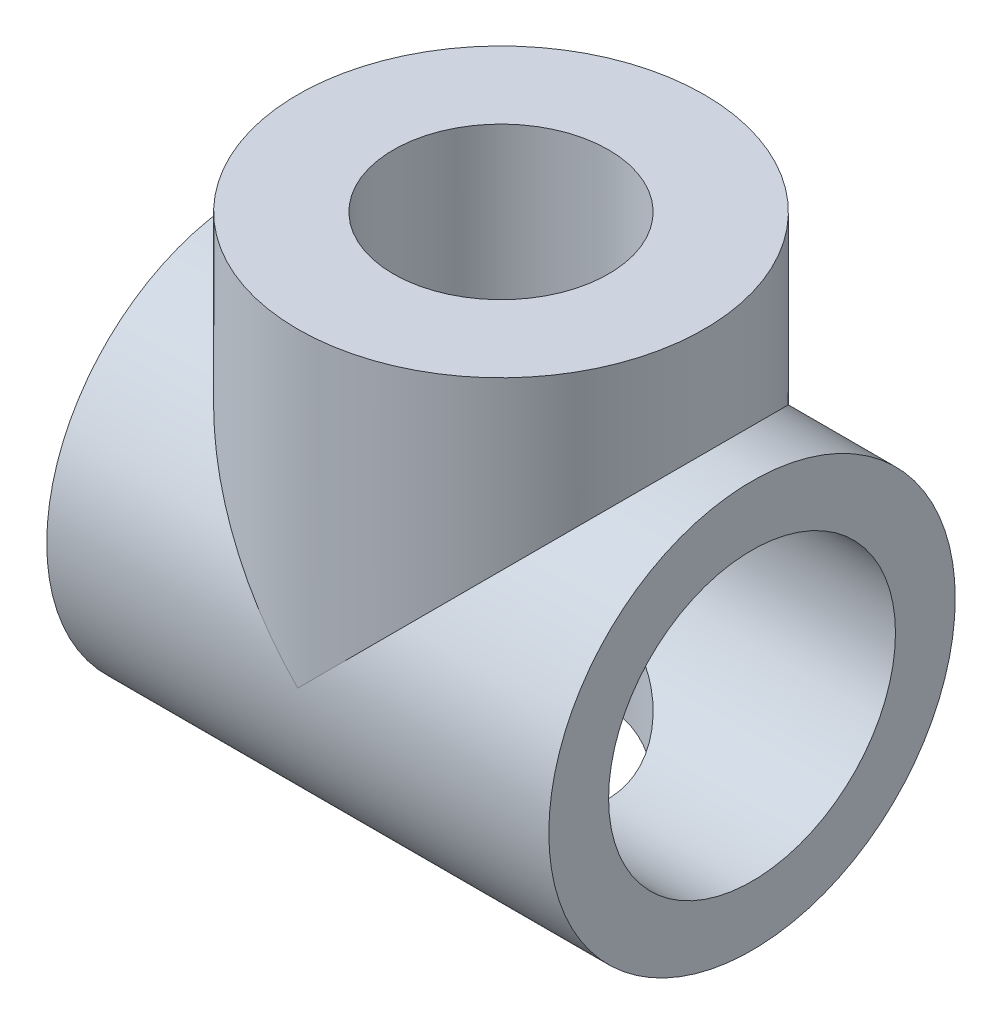
ISO-10303-21;
HEADER;
FILE_DESCRIPTION(('STEP AP214'),'2;1');
FILE_NAME('part.step','',(''),(''),'','','');
FILE_SCHEMA(('AUTOMOTIVE_DESIGN { 1 0 10303 214 1 1 1 1 }'));
ENDSEC;
DATA;
#1=APPLICATION_CONTEXT('core data for automotive mechanical design processes');
#2=APPLICATION_PROTOCOL_DEFINITION('international standard','automotive_design',2000,#1);
#3=PRODUCT_CONTEXT('',#1,'mechanical');
#4=PRODUCT('Part','Part','',(#3));
#5=PRODUCT_RELATED_PRODUCT_CATEGORY('part','',(#4));
#6=PRODUCT_DEFINITION_FORMATION('','',#4);
#7=PRODUCT_DEFINITION_CONTEXT('part definition',#1,'design');
#8=PRODUCT_DEFINITION('design','',#6,#7);
#9=PRODUCT_DEFINITION_SHAPE('','',#8);
#10=(LENGTH_UNIT() NAMED_UNIT(*) SI_UNIT(.MILLI.,.METRE.));
#11=(NAMED_UNIT(*) PLANE_ANGLE_UNIT() SI_UNIT($,.RADIAN.));
#12=(NAMED_UNIT(*) SI_UNIT($,.STERADIAN.) SOLID_ANGLE_UNIT());
#13=UNCERTAINTY_MEASURE_WITH_UNIT(LENGTH_MEASURE(1.E-05),#10,'distance_accuracy_value','');
#14=(GEOMETRIC_REPRESENTATION_CONTEXT(3) GLOBAL_UNCERTAINTY_ASSIGNED_CONTEXT((#13)) GLOBAL_UNIT_ASSIGNED_CONTEXT((#10,
#11,#12)) REPRESENTATION_CONTEXT('',''));
#15=CARTESIAN_POINT('',(0.,0.,0.));
#16=DIRECTION('',(0.,0.,1.));
#17=DIRECTION('',(1.,0.,0.));
#18=AXIS2_PLACEMENT_3D('',#15,#16,#17);
#19=CARTESIAN_POINT('',(-21.,0.,0.));
#20=DIRECTION('',(1.,0.,0.));
#21=DIRECTION('',(0.,0.,-1.));
#22=AXIS2_PLACEMENT_3D('',#19,#20,#21);
#23=CYLINDRICAL_SURFACE('',#22,17.);
#24=CARTESIAN_POINT('',(21.,0.,0.));
#25=DIRECTION('',(1.,0.,0.));
#26=DIRECTION('',(0.,0.,-1.));
#27=AXIS2_PLACEMENT_3D('',#24,#25,#26);
#28=CIRCLE('',#27,17.);
#29=CARTESIAN_POINT('',(21.,0.,-17.));
#30=VERTEX_POINT('',#29);
#31=EDGE_CURVE('E127',#30,#30,#28,.T.);
#32=ORIENTED_EDGE('',*,*,#31,.F.);
#33=EDGE_LOOP('',(#32));
#34=FACE_BOUND('',#33,.T.);
#35=CARTESIAN_POINT('',(-21.,0.,0.));
#36=DIRECTION('',(1.,0.,0.));
#37=DIRECTION('',(0.,0.,-1.));
#38=AXIS2_PLACEMENT_3D('',#35,#36,#37);
#39=CIRCLE('',#38,17.);
#40=CARTESIAN_POINT('',(-21.,0.,-17.));
#41=VERTEX_POINT('',#40);
#42=EDGE_CURVE('E66',#41,#41,#39,.T.);
#43=ORIENTED_EDGE('',*,*,#42,.T.);
#44=EDGE_LOOP('',(#43));
#45=FACE_BOUND('',#44,.T.);
#46=CARTESIAN_POINT('',(0.,0.,0.));
#47=DIRECTION('',(0.707106781186547,-0.707106781186547,0.));
#48=DIRECTION('',(-0.707106781186547,-0.707106781186547,0.));
#49=AXIS2_PLACEMENT_3D('',#46,#47,#48);
#50=ELLIPSE('',#49,24.0416305603426,17.);
#51=CARTESIAN_POINT('',(0.,0.,17.));
#52=VERTEX_POINT('',#51);
#53=CARTESIAN_POINT('',(0.,0.,-17.));
#54=VERTEX_POINT('',#53);
#55=EDGE_CURVE('E54',#52,#54,#50,.F.);
#56=ORIENTED_EDGE('',*,*,#55,.F.);
#57=CARTESIAN_POINT('',(0.,0.,0.));
#58=DIRECTION('',(-0.707106781186547,-0.707106781186547,0.));
#59=DIRECTION('',(0.707106781186547,-0.707106781186547,0.));
#60=AXIS2_PLACEMENT_3D('',#57,#58,#59);
#61=ELLIPSE('',#60,24.0416305603426,17.);
#62=EDGE_CURVE('E62',#54,#52,#61,.F.);
#63=ORIENTED_EDGE('',*,*,#62,.F.);
#64=EDGE_LOOP('',(#56,#63));
#65=FACE_BOUND('',#64,.T.);
#66=CARTESIAN_POINT('',(0.,-14.422205101856,-9.));
#67=CARTESIAN_POINT('',(-0.232373529451211,-14.4222043763024,-9.00000062576505));
#68=CARTESIAN_POINT('',(-0.464740452590223,-14.4278398144868,-8.99098923459077));
#69=CARTESIAN_POINT('',(-0.92763874877839,-14.4501573437859,-8.95507663420356));
#70=CARTESIAN_POINT('',(-1.15816937617861,-14.4668437117943,-8.9281684986357));
#71=CARTESIAN_POINT('',(-1.61579589330959,-14.5106455372305,-8.85680034590887));
#72=CARTESIAN_POINT('',(-1.84288674844299,-14.5377749860646,-8.81231677946018));
#73=CARTESIAN_POINT('',(-2.29180786581765,-14.6014717364069,-8.70636754509761));
#74=CARTESIAN_POINT('',(-2.51363575641698,-14.638043207756,-8.64489437328773));
#75=CARTESIAN_POINT('',(-2.94918399130645,-14.7191092082797,-8.50612898991123));
#76=CARTESIAN_POINT('',(-3.16294671898519,-14.7635521965977,-8.42893922268629));
#77=CARTESIAN_POINT('',(-3.58281344196142,-14.8591634139008,-8.25922184623658));
#78=CARTESIAN_POINT('',(-3.7889146028692,-14.9103341006475,-8.16668862850277));
#79=CARTESIAN_POINT('',(-4.19244887279489,-15.017949561011,-7.96705976018305));
#80=CARTESIAN_POINT('',(-4.38988328965565,-15.0743935348204,-7.85996631685035));
#81=CARTESIAN_POINT('',(-4.77536979352251,-15.1911291614756,-7.63190690499492));
#82=CARTESIAN_POINT('',(-4.96342156186845,-15.2514209448452,-7.51094046576726));
#83=CARTESIAN_POINT('',(-5.3465417828879,-15.3801817781599,-7.24389221821668));
#84=CARTESIAN_POINT('',(-5.5406319721487,-15.4488893762406,-7.0965205152372));
#85=CARTESIAN_POINT('',(-5.91600233276169,-15.5874517353745,-6.78676189218288));
#86=CARTESIAN_POINT('',(-6.09728183815375,-15.6573065558334,-6.6243741925168));
#87=CARTESIAN_POINT('',(-6.44629481328567,-15.7964899608243,-6.28526115469159));
#88=CARTESIAN_POINT('',(-6.61402204786294,-15.8658182899863,-6.10852929114645));
#89=CARTESIAN_POINT('',(-6.93500137489115,-16.0022854457377,-5.74153249314863));
#90=CARTESIAN_POINT('',(-7.08825114589662,-16.0694239200601,-5.55126539688179));
#91=CARTESIAN_POINT('',(-7.39072079290602,-16.2050322948974,-5.14264577769022));
#92=CARTESIAN_POINT('',(-7.53868759939727,-16.2731954920296,-4.92326054964398));
#93=CARTESIAN_POINT('',(-7.8153804025033,-16.403208903292,-4.47102472447402));
#94=CARTESIAN_POINT('',(-7.94411471833436,-16.4650618432972,-4.23818001019603));
#95=CARTESIAN_POINT('',(-8.1810886831158,-16.580697109142,-3.76043332600801));
#96=CARTESIAN_POINT('',(-8.28933431038829,-16.6344817882378,-3.51553489956948));
#97=CARTESIAN_POINT('',(-8.48407432295711,-16.7323765772602,-3.01537336993476));
#98=CARTESIAN_POINT('',(-8.57057135100269,-16.7764878625518,-2.76011153041601));
#99=CARTESIAN_POINT('',(-8.71476751089212,-16.8506278802714,-2.26159183704002));
#100=CARTESIAN_POINT('',(-8.77418919813568,-16.8814878867179,-2.01895536343818));
#101=CARTESIAN_POINT('',(-8.87277636517636,-16.9329379341249,-1.52852351721971));
#102=CARTESIAN_POINT('',(-8.91194281211255,-16.9535284654265,-1.28072839150413));
#103=CARTESIAN_POINT('',(-8.96945137777015,-16.9838293901003,-0.782216556126573));
#104=CARTESIAN_POINT('',(-8.9878055888794,-16.9935461013692,-0.531501628581769));
#105=CARTESIAN_POINT('',(-9.00345814156065,-17.0018296226732,-0.0292384034881089));
#106=CARTESIAN_POINT('',(-9.00075798410504,-17.0003972275317,0.2223098333759));
#107=CARTESIAN_POINT('',(-8.97563788206268,-16.9871123112241,0.699528550806311));
#108=CARTESIAN_POINT('',(-8.95516404622293,-16.9762881858903,0.92533339178118));
#109=CARTESIAN_POINT('',(-8.89734980776647,-16.9458616709079,1.3741772285691));
#110=CARTESIAN_POINT('',(-8.8600092712912,-16.9262592115921,1.59721620241707));
#111=CARTESIAN_POINT('',(-8.7688865329215,-16.8787399347702,2.03899511286714));
#112=CARTESIAN_POINT('',(-8.71510449295321,-16.8508231991484,2.25773509178582));
#113=CARTESIAN_POINT('',(-8.59166973477852,-16.7873163773799,2.68954353701739));
#114=CARTESIAN_POINT('',(-8.52201641754748,-16.7517260016121,2.90261178892497));
#115=CARTESIAN_POINT('',(-8.36657855228801,-16.6731844590158,3.32437519757208));
#116=CARTESIAN_POINT('',(-8.28061048068221,-16.63015009721,3.53298720919376));
#117=CARTESIAN_POINT('',(-8.0938560894615,-16.5379543929982,3.94209436713934));
#118=CARTESIAN_POINT('',(-7.99306487662943,-16.4887910281872,4.14258680515773));
#119=CARTESIAN_POINT('',(-7.66964763036743,-16.3336317187681,4.73036313157018));
#120=CARTESIAN_POINT('',(-7.42588359718037,-16.2199174406707,5.10419965765736));
#121=CARTESIAN_POINT('',(-6.86049219183615,-15.9685886380079,5.8457572658455));
#122=CARTESIAN_POINT('',(-6.53344396069786,-15.8297190296641,6.20892118613643));
#123=CARTESIAN_POINT('',(-6.00260510055091,-15.6206546008118,6.71030256073168));
#124=CARTESIAN_POINT('',(-5.81878357236495,-15.5507832627235,6.87031351189004));
#125=CARTESIAN_POINT('',(-5.43836013979317,-15.4124737454541,7.17520945568927));
#126=CARTESIAN_POINT('',(-5.24175615628497,-15.3440358018266,7.32009197758702));
#127=CARTESIAN_POINT('',(-4.8209075098852,-15.2052191906499,7.60449051092364));
#128=CARTESIAN_POINT('',(-4.59570208594305,-15.1351028023996,7.74271518715582));
#129=CARTESIAN_POINT('',(-4.13268897597319,-15.0010019642641,7.99943172794706));
#130=CARTESIAN_POINT('',(-3.89488702717496,-14.9370147594388,8.11793247583611));
#131=CARTESIAN_POINT('',(-3.40807604935347,-14.8175356444393,8.33401969853009));
#132=CARTESIAN_POINT('',(-3.15907435897716,-14.7620382732747,8.43161963384427));
#133=CARTESIAN_POINT('',(-2.65141648424013,-14.6617922698603,8.60475897696281));
#134=CARTESIAN_POINT('',(-2.39276177564518,-14.6170420022942,8.68030174144018));
#135=CARTESIAN_POINT('',(-1.88917564194414,-14.5434543284165,8.80298999001995));
#136=CARTESIAN_POINT('',(-1.64482953912013,-14.5136216253731,8.85193994589715));
#137=CARTESIAN_POINT('',(-1.15175601241672,-14.466041774245,8.92948601647755));
#138=CARTESIAN_POINT('',(-0.903028856283356,-14.4482938902131,8.95808337062815));
#139=CARTESIAN_POINT('',(-0.403667423641377,-14.4256988216494,8.994424667776));
#140=CARTESIAN_POINT('',(-0.153034827599674,-14.4208413525752,9.00218523534004));
#141=CARTESIAN_POINT('',(0.347902273022042,-14.4242270885605,8.99675991934115));
#142=CARTESIAN_POINT('',(0.598206804927149,-14.4324691226036,8.98357590809702));
#143=CARTESIAN_POINT('',(1.06366399324733,-14.4597579564631,8.93957215018169));
#144=CARTESIAN_POINT('',(1.27915222720319,-14.4772591090859,8.91127068512541));
#145=CARTESIAN_POINT('',(1.70669034014811,-14.5212797481174,8.83935590008577));
#146=CARTESIAN_POINT('',(1.91873907769009,-14.5478021667086,8.79573760152178));
#147=CARTESIAN_POINT('',(2.33801237179456,-14.6090140692136,8.6936896932991));
#148=CARTESIAN_POINT('',(2.54523732639165,-14.6437028766337,8.63526131045897));
#149=CARTESIAN_POINT('',(2.95382133152171,-14.7202145404589,8.50417724270343));
#150=CARTESIAN_POINT('',(3.15517800319165,-14.7620402441622,8.43151587775468));
#151=CARTESIAN_POINT('',(3.76647482436573,-14.9004878042736,8.18607612769588));
#152=CARTESIAN_POINT('',(4.16515042576479,-15.0072408262313,7.99034464700556));
#153=CARTESIAN_POINT('',(4.92629975561252,-15.2360140563594,7.54495496074514));
#154=CARTESIAN_POINT('',(5.28875485143937,-15.3580420503437,7.29526920663774));
#155=CARTESIAN_POINT('',(5.82625691230495,-15.553523453554,6.86423359080789));
#156=CARTESIAN_POINT('',(6.01522159630074,-15.6254600961081,6.69925236107796));
#157=CARTESIAN_POINT('',(6.37878064710984,-15.7689867315602,6.35405022511538));
#158=CARTESIAN_POINT('',(6.5533789779591,-15.8405768149165,6.17383355073655));
#159=CARTESIAN_POINT('',(6.88743765604704,-15.9816725048945,5.79882063574023));
#160=CARTESIAN_POINT('',(7.04688473675299,-16.0511762489369,5.60401188025866));
#161=CARTESIAN_POINT('',(7.34941178301582,-16.1862764029393,5.20092433110434));
#162=CARTESIAN_POINT('',(7.49249856426548,-16.2518744345183,4.99265120370711));
#163=CARTESIAN_POINT('',(7.7666794846933,-16.3800499925179,4.55499703766289));
#164=CARTESIAN_POINT('',(7.89706578251143,-16.4424020251843,4.32510507219349));
#165=CARTESIAN_POINT('',(8.13778440961506,-16.5593618774268,3.85313308253476));
#166=CARTESIAN_POINT('',(8.24811583898236,-16.6139693494586,3.61105251203066));
#167=CARTESIAN_POINT('',(8.44736382866169,-16.7137824698965,3.11657401761835));
#168=CARTESIAN_POINT('',(8.5362973178793,-16.7589955467559,2.86418443581422));
#169=CARTESIAN_POINT('',(8.69166326636912,-16.8386624950657,2.3509257370342));
#170=CARTESIAN_POINT('',(8.75809878749058,-16.8731178305354,2.0900577792189));
#171=CARTESIAN_POINT('',(8.86211408543353,-16.9273537419758,1.58809323595221));
#172=CARTESIAN_POINT('',(8.90188584843924,-16.9482426208988,1.34756873674454));
#173=CARTESIAN_POINT('',(8.96180668371501,-16.9797916705842,0.863424053523259));
#174=CARTESIAN_POINT('',(8.98195707085504,-16.9904525267472,0.619804078052585));
#175=CARTESIAN_POINT('',(9.00235286320157,-17.001243574032,0.131592090635574));
#176=CARTESIAN_POINT('',(9.00260572696796,-17.0013777110803,-0.112999522710721));
#177=CARTESIAN_POINT('',(8.98322114056142,-16.991120992441,-0.601165648538066));
#178=CARTESIAN_POINT('',(8.96358447846036,-16.980730553763,-0.844740200933611));
#179=CARTESIAN_POINT('',(8.90704436985784,-16.9509562574503,-1.3095574412149));
#180=CARTESIAN_POINT('',(8.87163923401459,-16.9323538261532,-1.53103485865268));
#181=CARTESIAN_POINT('',(8.78460053621235,-16.8869129137305,-1.9699931590121));
#182=CARTESIAN_POINT('',(8.73296149337009,-16.8600716510873,-2.18747266587423));
#183=CARTESIAN_POINT('',(8.61402084308521,-16.7987725979753,-2.61692155464159));
#184=CARTESIAN_POINT('',(8.54672403058221,-16.764317139393,-2.8288926013765));
#185=CARTESIAN_POINT('',(8.39707858895186,-16.6885220108339,-3.24626606332047));
#186=CARTESIAN_POINT('',(8.31472418885774,-16.6471797019468,-3.45166592447323));
#187=CARTESIAN_POINT('',(8.13228147506046,-16.5567957606468,-3.86243518950489));
#188=CARTESIAN_POINT('',(8.03163792753637,-16.5075211470498,-4.06750647742742));
#189=CARTESIAN_POINT('',(7.81569204214586,-16.4035388050147,-4.46842538990806));
#190=CARTESIAN_POINT('',(7.70038434850761,-16.3488290931265,-4.66426960847641));
#191=CARTESIAN_POINT('',(7.45592784270197,-16.2351209327442,-5.04583856621044));
#192=CARTESIAN_POINT('',(7.32677720648336,-16.1761219193895,-5.23156196690485));
#193=CARTESIAN_POINT('',(7.05540905876764,-16.0550319812806,-5.59214896019523));
#194=CARTESIAN_POINT('',(6.91319023666751,-15.9929407466954,-5.76701146060219));
#195=CARTESIAN_POINT('',(6.60020181561065,-15.8600269131364,-6.12369239499591));
#196=CARTESIAN_POINT('',(6.42801033123554,-15.7889911707323,-6.30418585297529));
#197=CARTESIAN_POINT('',(6.06935607219238,-15.6464055505263,-6.65018919872483));
#198=CARTESIAN_POINT('',(5.88289202176917,-15.5748556272833,-6.81569774417365));
#199=CARTESIAN_POINT('',(5.49635981371422,-15.4330042199717,-7.13108065553284));
#200=CARTESIAN_POINT('',(5.29627706728585,-15.3627041797798,-7.28093780553379));
#201=CARTESIAN_POINT('',(4.88358019679142,-15.2253571173574,-7.56394367203928));
#202=CARTESIAN_POINT('',(4.67096682373273,-15.1583099006111,-7.69709338838924));
#203=CARTESIAN_POINT('',(4.22292235105009,-15.0261422509569,-7.95215261769948));
#204=CARTESIAN_POINT('',(3.98688024174743,-14.9612970464184,-8.07313527797574));
#205=CARTESIAN_POINT('',(3.5032223294721,-14.8397371057199,-8.29446575182941));
#206=CARTESIAN_POINT('',(3.25560457390522,-14.7830237478595,-8.39481006857936));
#207=CARTESIAN_POINT('',(2.7511759218555,-14.6801975843741,-8.57335390762207));
#208=CARTESIAN_POINT('',(2.4943934085963,-14.6340548617029,-8.65161607624996));
#209=CARTESIAN_POINT('',(1.97315998475943,-14.5542824201999,-8.78515446055727));
#210=CARTESIAN_POINT('',(1.70871431287091,-14.5206443607581,-8.84044600054968));
#211=CARTESIAN_POINT('',(1.20419256849498,-14.4704605563623,-8.92232041079801));
#212=CARTESIAN_POINT('',(0.964668329748119,-14.4524324048506,-8.95140803755293));
#213=CARTESIAN_POINT('',(0.48342707854218,-14.4283047795495,-8.99024795310022));
#214=CARTESIAN_POINT('',(0.241709965350477,-14.4222058565612,-8.99999934909261));
#215=CARTESIAN_POINT('',(0.,-14.422205101856,-9.));
#216=B_SPLINE_CURVE_WITH_KNOTS('',3,(#66,#67,#68,#69,#70,#71,#72,#73,#74,#75,#76,#77,#78,#79,
#80,#81,#82,#83,#84,#85,#86,#87,#88,#89,#90,#91,#92,#93,#94,#95,#96,#97,#98,#99,#100,#101,#102,
#103,#104,#105,#106,#107,#108,#109,#110,#111,#112,#113,#114,#115,#116,#117,#118,#119,#120,#121,
#122,#123,#124,#125,#126,#127,#128,#129,#130,#131,#132,#133,#134,#135,#136,#137,#138,#139,#140,
#141,#142,#143,#144,#145,#146,#147,#148,#149,#150,#151,#152,#153,#154,#155,#156,#157,#158,#159,
#160,#161,#162,#163,#164,#165,#166,#167,#168,#169,#170,#171,#172,#173,#174,#175,#176,#177,#178,
#179,#180,#181,#182,#183,#184,#185,#186,#187,#188,#189,#190,#191,#192,#193,#194,#195,#196,#197,
#198,#199,#200,#201,#202,#203,#204,#205,#206,#207,#208,#209,#210,#211,#212,#213,#214,#215),
.UNSPECIFIED.,.T.,.F.,(4,2,2,2,2,2,2,2,2,2,2,2,2,2,2,2,2,2,2,2,2,2,2,2,2,2,2,2,2,2,2,2,2,2,2,2,
2,2,2,2,2,2,2,2,2,2,2,2,2,2,2,2,2,2,2,2,2,2,2,2,2,2,2,2,2,2,2,2,2,2,2,2,2,2,4),(0.,
0.696869112714834,1.39400808309362,2.09208433393308,2.79046940219053,3.4844401455653,
4.17866511832918,4.87278496735879,5.56692837455497,6.32573512819672,7.08458129924062,
7.84377463733496,8.60308950535355,9.42180374576619,10.2401628109038,11.0582827205867,
11.8763031695285,12.6303806643799,13.3844221505178,14.1380252963519,14.8915747180783,
15.5717364011117,16.2519034821812,16.9320638647584,17.6122499226692,18.3005972200418,
18.9891722575848,20.3655060888116,21.8829591839488,22.6429096431477,23.4029840223642,
24.2221068990266,25.0408598521895,25.8590839169306,26.6771833988846,27.4290204606706,
28.1808117326233,28.9320030117109,29.6831271426157,30.336504362395,30.99009415266,
31.6436298193849,32.2974268294518,33.6621236162513,35.0275188576417,35.8096726732542,
36.591609944264,37.3742256945812,38.156514210378,38.9700674555651,39.7836571981607,
40.596601139864,41.4094343998802,42.1424985433663,42.8755135592893,43.608253804209,
44.3409650172962,45.0153720507556,45.6900070221417,46.3644356687288,47.0391233405409,
47.7394647191358,48.4400626212934,49.1407529533038,49.8415136341183,50.6187837295646,
51.3961233827141,52.1743092675258,52.9524485600795,53.7705008193654,54.5886915701616,
55.404537250543,56.2198377813218,56.9446726312256,57.6695409477069),.UNSPECIFIED.);
#217=CARTESIAN_POINT('',(0.,-14.422205101856,-9.));
#218=VERTEX_POINT('',#217);
#219=EDGE_CURVE('E90',#218,#218,#216,.T.);
#220=ORIENTED_EDGE('',*,*,#219,.T.);
#221=EDGE_LOOP('',(#220));
#222=FACE_BOUND('',#221,.T.);
#223=ADVANCED_FACE('F39',(#34,#45,#65,#222),#23,.T.);
#224=CARTESIAN_POINT('',(21.,0.,0.));
#225=DIRECTION('',(-1.,0.,0.));
#226=DIRECTION('',(0.,0.,1.));
#227=AXIS2_PLACEMENT_3D('',#224,#225,#226);
#228=CYLINDRICAL_SURFACE('',#227,12.);
#229=CARTESIAN_POINT('',(0.,-7.93725393319378,-9.));
#230=CARTESIAN_POINT('',(0.210047945354589,-7.93726008769209,-8.99999700492846));
#231=CARTESIAN_POINT('',(0.420142077343502,-7.94564059997079,-8.99262506088692));
#232=CARTESIAN_POINT('',(0.838045929195139,-7.97865018535012,-8.96334784421954));
#233=CARTESIAN_POINT('',(1.04585486336312,-8.0032846796036,-8.94143772269537));
#234=CARTESIAN_POINT('',(1.45762679674959,-8.06741599335539,-8.88361711104554));
#235=CARTESIAN_POINT('',(1.66158026311608,-8.10694559516818,-8.84767573350096));
#236=CARTESIAN_POINT('',(2.0638352347195,-8.19884235317378,-8.76258489524339));
#237=CARTESIAN_POINT('',(2.26213324916174,-8.25121725447619,-8.71342746414681));
#238=CARTESIAN_POINT('',(2.64925874237046,-8.3656947597056,-8.60356525931345));
#239=CARTESIAN_POINT('',(2.83818139531385,-8.42764667039382,-8.54303667662039));
#240=CARTESIAN_POINT('',(3.20903155435823,-8.55966578516624,-8.41075981679049));
#241=CARTESIAN_POINT('',(3.39095984006061,-8.62973208129692,-8.33901279461918));
#242=CARTESIAN_POINT('',(3.92593048375625,-8.84911786971174,-8.1078967220267));
#243=CARTESIAN_POINT('',(4.26845266022529,-9.00771710513604,-7.93256747620498));
#244=CARTESIAN_POINT('',(4.79449298111879,-9.27134774561229,-7.62010706297185));
#245=CARTESIAN_POINT('',(4.98738379901041,-9.37279820688496,-7.49523611495529));
#246=CARTESIAN_POINT('',(5.36246284391734,-9.57764573331366,-7.23163301821777));
#247=CARTESIAN_POINT('',(5.54465018857393,-9.68104295802921,-7.09289972927053));
#248=CARTESIAN_POINT('',(5.89824125314021,-9.88780382820126,-6.80171201703297));
#249=CARTESIAN_POINT('',(6.06962902217547,-9.99116720958863,-6.64923807036801));
#250=CARTESIAN_POINT('',(6.40090135117742,-10.1958119550385,-6.3309727217583));
#251=CARTESIAN_POINT('',(6.56078586718667,-10.2970933111438,-6.16518126892845));
#252=CARTESIAN_POINT('',(6.89990963061083,-10.5161174259194,-5.78521241974898));
#253=CARTESIAN_POINT('',(7.0764168556198,-10.6329889481264,-5.56807508037328));
#254=CARTESIAN_POINT('',(7.41033819872256,-10.8580806393513,-5.11527308350169));
#255=CARTESIAN_POINT('',(7.56774802310256,-10.9662988609696,-4.87960427909001));
#256=CARTESIAN_POINT('',(7.86123731171005,-11.1708551657334,-4.39112448711177));
#257=CARTESIAN_POINT('',(7.99735693973472,-11.2672155435241,-4.13834709829603));
#258=CARTESIAN_POINT('',(8.24636374948501,-11.4453021908216,-3.61675046873795));
#259=CARTESIAN_POINT('',(8.35926322117876,-11.5270361987841,-3.34793981178401));
#260=CARTESIAN_POINT('',(8.52931240454799,-11.6510470866384,-2.87972534634464));
#261=CARTESIAN_POINT('',(8.59300514968108,-11.6977883308111,-2.68385116124619));
#262=CARTESIAN_POINT('',(8.70719953010689,-11.7819280636668,-2.28635185786148));
#263=CARTESIAN_POINT('',(8.75770432369216,-11.8193287891532,-2.08472812934717));
#264=CARTESIAN_POINT('',(8.84482565226319,-11.8840267025366,-1.67704518510364));
#265=CARTESIAN_POINT('',(8.88145145128226,-11.9113306296095,-1.47098902538559));
#266=CARTESIAN_POINT('',(8.940329620786,-11.9552962912754,-1.05569247788542));
#267=CARTESIAN_POINT('',(8.9625814760385,-11.9719576443866,-0.846451976236114));
#268=CARTESIAN_POINT('',(8.99240142040101,-11.9942980249635,-0.425786006339292));
#269=CARTESIAN_POINT('',(8.99993087863759,-11.9999481593843,-0.214356249299964));
#270=CARTESIAN_POINT('',(9.00006817197728,-12.0000511285769,0.208510065394761));
#271=CARTESIAN_POINT('',(8.99267606612721,-11.9945040076578,0.419946623019937));
#272=CARTESIAN_POINT('',(8.96308696595144,-11.9723361276214,0.841232961940921));
#273=CARTESIAN_POINT('',(8.94088704507851,-11.9557131795301,1.05108242127718));
#274=CARTESIAN_POINT('',(8.88202666528978,-11.91175952135,1.46759716786933));
#275=CARTESIAN_POINT('',(8.84536630234775,-11.884428882328,1.67426247624893));
#276=CARTESIAN_POINT('',(8.75963576561918,-11.8207624618912,2.07593135593429));
#277=CARTESIAN_POINT('',(8.71103834107328,-11.7847705995305,2.27109110323147));
#278=CARTESIAN_POINT('',(8.601463443314,-11.7040079560834,2.65610708366029));
#279=CARTESIAN_POINT('',(8.54048165956892,-11.6592341185062,2.84596144393919));
#280=CARTESIAN_POINT('',(8.40685252358632,-11.5617076348438,3.21933855599491));
#281=CARTESIAN_POINT('',(8.33420811635907,-11.5089570032293,3.40286289203465));
#282=CARTESIAN_POINT('',(8.17793557020214,-11.3963019808328,3.76296650073168));
#283=CARTESIAN_POINT('',(8.09430344250448,-11.3363949928669,3.93954322086584));
#284=CARTESIAN_POINT('',(7.90719531405391,-11.2035232641165,4.30378588140324));
#285=CARTESIAN_POINT('',(7.80255192082885,-11.129847059551,4.49059379921736));
#286=CARTESIAN_POINT('',(7.58156081652009,-10.9760554268286,4.85440889308923));
#287=CARTESIAN_POINT('',(7.4652081856563,-10.8959372948829,5.03141190065809));
#288=CARTESIAN_POINT('',(7.09969060456716,-10.6476940478331,5.54724944127269));
#289=CARTESIAN_POINT('',(6.83406064784081,-10.4716762362332,5.87092272315764));
#290=CARTESIAN_POINT('',(6.37896317466503,-10.1820425358953,6.3537910740115));
#291=CARTESIAN_POINT('',(6.20170533555787,-10.0717287555428,6.52686902280105));
#292=CARTESIAN_POINT('',(5.8339973996875,-9.84956990495244,6.85751963167764));
#293=CARTESIAN_POINT('',(5.64354476338401,-9.73772454328052,7.0150892927528));
#294=CARTESIAN_POINT('',(5.24987544653014,-9.51497926304422,7.31436974021301));
#295=CARTESIAN_POINT('',(5.04665206901147,-9.40407987575603,7.45607209560136));
#296=CARTESIAN_POINT('',(4.62776966050861,-9.18609053264199,7.7230439593456));
#297=CARTESIAN_POINT('',(4.41211342315151,-9.07899972971516,7.84831713873149));
#298=CARTESIAN_POINT('',(4.0122075628318,-8.89230175064854,8.05870205966756));
#299=CARTESIAN_POINT('',(3.83014541952843,-8.81143781001446,8.14686298749761));
#300=CARTESIAN_POINT('',(3.45813249384851,-8.6562178697362,8.31160003485239));
#301=CARTESIAN_POINT('',(3.26818180096174,-8.58186179629478,8.38817628575099));
#302=CARTESIAN_POINT('',(2.88096864122825,-8.44200530333541,8.52891415509824));
#303=CARTESIAN_POINT('',(2.68371988758802,-8.37648925269761,8.59309777546026));
#304=CARTESIAN_POINT('',(2.28214704026724,-8.25660529743018,8.70835203906579));
#305=CARTESIAN_POINT('',(2.0778257709943,-8.20223300123507,8.75942784988444));
#306=CARTESIAN_POINT('',(1.70412217059056,-8.11651502889636,8.83882850828779));
#307=CARTESIAN_POINT('',(1.53582721559991,-8.08274185436784,8.86965539928518));
#308=CARTESIAN_POINT('',(1.19616276404445,-8.02513724983308,8.92180971113034));
#309=CARTESIAN_POINT('',(1.02479506136833,-8.00130020427445,8.94314249817614));
#310=CARTESIAN_POINT('',(0.680097364480576,-7.96449630407447,8.97593509653417));
#311=CARTESIAN_POINT('',(0.506769204364536,-7.9515200238538,8.98740346897668));
#312=CARTESIAN_POINT('',(0.159253094620623,-7.93695333664642,9.00027048562989));
#313=CARTESIAN_POINT('',(-0.0149348638307105,-7.93536304674963,9.00166902628564));
#314=CARTESIAN_POINT('',(-0.362879350212139,-7.94364018314973,8.99436543755864));
#315=CARTESIAN_POINT('',(-0.536635717274004,-7.95351138074574,8.98565998354792));
#316=CARTESIAN_POINT('',(-0.882365217034983,-7.98429159422233,8.95832052102714));
#317=CARTESIAN_POINT('',(-1.05433834769069,-8.00520062274973,8.93968650114121));
#318=CARTESIAN_POINT('',(-1.39560544217011,-8.05724702704553,8.89280562651887));
#319=CARTESIAN_POINT('',(-1.56489581361444,-8.08839707277409,8.86454686269582));
#320=CARTESIAN_POINT('',(-1.89980564235921,-8.15980763291469,8.7988572216387));
#321=CARTESIAN_POINT('',(-2.0654228945175,-8.20007346563849,8.7614209890459));
#322=CARTESIAN_POINT('',(-2.45349284207391,-8.30499042232178,8.66222331604646));
#323=CARTESIAN_POINT('',(-2.67402231393399,-8.37312824030809,8.5966014364667));
#324=CARTESIAN_POINT('',(-3.10590246543935,-8.52088047447664,8.4501715586241));
#325=CARTESIAN_POINT('',(-3.31725302418304,-8.60049504176718,8.36936336040677));
#326=CARTESIAN_POINT('',(-3.73077231591406,-8.76828905787122,8.19340630318842));
#327=CARTESIAN_POINT('',(-3.93292593098628,-8.85648191049531,8.0982348689868));
#328=CARTESIAN_POINT('',(-4.32753870623069,-9.03863686622729,7.89441106526341));
#329=CARTESIAN_POINT('',(-4.51999873980326,-9.13259844786869,7.78575991334227));
#330=CARTESIAN_POINT('',(-4.90180991263666,-9.32737029179403,7.551436118696));
#331=CARTESIAN_POINT('',(-5.09081116972656,-9.42830523194776,7.42529782974467));
#332=CARTESIAN_POINT('',(-5.45829490188362,-9.6316957889483,7.15950114372978));
#333=CARTESIAN_POINT('',(-5.63677373945681,-9.73415191650946,7.01983811487991));
#334=CARTESIAN_POINT('',(-5.98292305403432,-9.93860471734104,6.72725781221161));
#335=CARTESIAN_POINT('',(-6.15059004760186,-10.0406012327828,6.57433630351993));
#336=CARTESIAN_POINT('',(-6.47458853361291,-10.2422766253488,6.25550647779105));
#337=CARTESIAN_POINT('',(-6.63091988453178,-10.3419554735266,6.08959799866627));
#338=CARTESIAN_POINT('',(-6.96449579754631,-10.558635371644,5.70731553420715));
#339=CARTESIAN_POINT('',(-7.1388422830702,-10.6746602145857,5.48783754128755));
#340=CARTESIAN_POINT('',(-7.46821642957763,-10.8976869976134,5.03042447106934));
#341=CARTESIAN_POINT('',(-7.62323970527303,-11.0046868877648,4.79248522390458));
#342=CARTESIAN_POINT('',(-7.91171968233961,-11.2064581328722,4.29954629195373));
#343=CARTESIAN_POINT('',(-8.04521278850655,-11.3012500740479,4.04457645864977));
#344=CARTESIAN_POINT('',(-8.28865751370086,-11.4758287345712,3.51880116378812));
#345=CARTESIAN_POINT('',(-8.39862183796373,-11.5556235493259,3.24800434968827));
#346=CARTESIAN_POINT('',(-8.56313619757074,-11.6758381634808,2.77750418580964));
#347=CARTESIAN_POINT('',(-8.62436198654747,-11.7208474819153,2.58127726584339));
#348=CARTESIAN_POINT('',(-8.73359723263136,-11.801455727109,2.18330579663549));
#349=CARTESIAN_POINT('',(-8.78160984600538,-11.8370569011359,1.98156257776733));
#350=CARTESIAN_POINT('',(-8.86374851280414,-11.8981210340985,1.57390200697549));
#351=CARTESIAN_POINT('',(-8.89788426336896,-11.9235910723943,1.3679876758231));
#352=CARTESIAN_POINT('',(-8.95181865585455,-11.9638929789768,0.95324167414693));
#353=CARTESIAN_POINT('',(-8.97161676208514,-11.9787244497798,0.744409894917113));
#354=CARTESIAN_POINT('',(-8.99659431522144,-11.9974430779279,0.324884695640045));
#355=CARTESIAN_POINT('',(-9.00173909982484,-12.0013042851586,0.114188042136572));
#356=CARTESIAN_POINT('',(-8.99722866484595,-11.9979215480564,-0.306955794475635));
#357=CARTESIAN_POINT('',(-8.98757350915576,-11.9906776516648,-0.517402978657416));
#358=CARTESIAN_POINT('',(-8.95361386267234,-11.9652444620605,-0.936486873084566));
#359=CARTESIAN_POINT('',(-8.92930606797922,-11.9470527003076,-1.14512316424111));
#360=CARTESIAN_POINT('',(-8.8664129094795,-11.9001193317115,-1.55901922759918));
#361=CARTESIAN_POINT('',(-8.82782758485476,-11.8713777538202,-1.76427900906524));
#362=CARTESIAN_POINT('',(-8.73827295443636,-11.8049371465475,-2.16409834167869));
#363=CARTESIAN_POINT('',(-8.68770025443613,-11.7675257026585,-2.35879513860119));
#364=CARTESIAN_POINT('',(-8.57423906650778,-11.6840104756011,-2.74271942941279));
#365=CARTESIAN_POINT('',(-8.51134628031041,-11.6379036589744,-2.93194498796222));
#366=CARTESIAN_POINT('',(-8.37397129550685,-11.5378153079113,-3.30392306461719));
#367=CARTESIAN_POINT('',(-8.29949208075624,-11.4838358011537,-3.48667723446667));
#368=CARTESIAN_POINT('',(-8.13962887945917,-11.3688379580791,-3.84512350390606));
#369=CARTESIAN_POINT('',(-8.05424094344346,-11.3078170732308,-4.02081301531876));
#370=CARTESIAN_POINT('',(-7.86306082297404,-11.1724062653076,-4.38394653542738));
#371=CARTESIAN_POINT('',(-7.75605343281862,-11.0972847590307,-4.57047931350219));
#372=CARTESIAN_POINT('',(-7.53032055541007,-10.9407103796168,-4.93356037107989));
#373=CARTESIAN_POINT('',(-7.41159012807201,-10.8592548404181,-5.1101043916035));
#374=CARTESIAN_POINT('',(-7.03889698607659,-10.6071832170656,-5.62433534603658));
#375=CARTESIAN_POINT('',(-6.76844098544897,-10.4288683126557,-5.94660507450687));
#376=CARTESIAN_POINT('',(-6.30535772293142,-10.136053020386,-6.42690005313683));
#377=CARTESIAN_POINT('',(-6.12497150932454,-10.0246138937666,-6.59899260441004));
#378=CARTESIAN_POINT('',(-5.75090020490056,-9.80052996349943,-6.92741382938934));
#379=CARTESIAN_POINT('',(-5.55721240800658,-9.68788491847748,-7.08373927936882));
#380=CARTESIAN_POINT('',(-5.15695789149234,-9.46396734687187,-7.38023509945723));
#381=CARTESIAN_POINT('',(-4.95038546738741,-9.35269545472389,-7.52039823457098));
#382=CARTESIAN_POINT('',(-4.52465921518905,-9.13450205463534,-7.78396481249521));
#383=CARTESIAN_POINT('',(-4.30550865782028,-9.02757942799008,-7.90737258440686));
#384=CARTESIAN_POINT('',(-3.90341787608838,-8.84375477190674,-8.11188178938271));
#385=CARTESIAN_POINT('',(-3.72287720476008,-8.76535585140607,-8.19636437548805));
#386=CARTESIAN_POINT('',(-3.35419206121469,-8.61523416732554,-8.35401600095731));
#387=CARTESIAN_POINT('',(-3.16604756977804,-8.54351142062202,-8.42718501172255));
#388=CARTESIAN_POINT('',(-2.78284384808429,-8.40904912078306,-8.56136086800866));
#389=CARTESIAN_POINT('',(-2.58780093919772,-8.34628992992426,-8.62239441920545));
#390=CARTESIAN_POINT('',(-2.19097915009296,-8.23191078990051,-8.73166161638731));
#391=CARTESIAN_POINT('',(-1.98920265309554,-8.18028694688297,-8.7798997380889));
#392=CARTESIAN_POINT('',(-1.63992446443893,-8.10366693550563,-8.85056166624525));
#393=CARTESIAN_POINT('',(-1.49384514330417,-8.07530085988767,-8.87640777362057));
#394=CARTESIAN_POINT('',(-1.19936603982905,-8.02604648991446,-8.92096881752922));
#395=CARTESIAN_POINT('',(-1.05096671554313,-8.00515673843959,-8.93968514368753));
#396=CARTESIAN_POINT('',(-0.752556000148464,-7.97147288659956,-8.96973432822484));
#397=CARTESIAN_POINT('',(-0.60254522544749,-7.95867579545284,-8.98106991432896));
#398=CARTESIAN_POINT('',(-0.301697466181475,-7.94156492166461,-8.99620310332121));
#399=CARTESIAN_POINT('',(-0.150860645548349,-7.9372495129097,-9.00000215112043));
#400=CARTESIAN_POINT('',(0.,-7.93725393319378,-9.));
#401=B_SPLINE_CURVE_WITH_KNOTS('',3,(#229,#230,#231,#232,#233,#234,#235,#236,#237,#238,#239,
#240,#241,#242,#243,#244,#245,#246,#247,#248,#249,#250,#251,#252,#253,#254,#255,#256,#257,#258,
#259,#260,#261,#262,#263,#264,#265,#266,#267,#268,#269,#270,#271,#272,#273,#274,#275,#276,#277,
#278,#279,#280,#281,#282,#283,#284,#285,#286,#287,#288,#289,#290,#291,#292,#293,#294,#295,#296,
#297,#298,#299,#300,#301,#302,#303,#304,#305,#306,#307,#308,#309,#310,#311,#312,#313,#314,#315,
#316,#317,#318,#319,#320,#321,#322,#323,#324,#325,#326,#327,#328,#329,#330,#331,#332,#333,#334,
#335,#336,#337,#338,#339,#340,#341,#342,#343,#344,#345,#346,#347,#348,#349,#350,#351,#352,#353,
#354,#355,#356,#357,#358,#359,#360,#361,#362,#363,#364,#365,#366,#367,#368,#369,#370,#371,#372,
#373,#374,#375,#376,#377,#378,#379,#380,#381,#382,#383,#384,#385,#386,#387,#388,#389,#390,#391,
#392,#393,#394,#395,#396,#397,#398,#399,#400),.UNSPECIFIED.,.T.,.F.,(4,2,2,2,2,2,2,2,2,2,2,2,2,
2,2,2,2,2,2,2,2,2,2,2,2,2,2,2,2,2,2,2,2,2,2,2,2,2,2,2,2,2,2,2,2,2,2,2,2,2,2,2,2,2,2,2,2,2,2,2,2,
2,2,2,2,2,2,2,2,2,2,2,2,2,2,2,2,2,2,2,2,2,2,2,2,4),(0.,0.629935985170249,1.26008217770227,
1.89162342333919,2.52354639876876,3.14638352770225,3.76915103192178,5.0137346262351,
5.76679810079426,6.51992356854165,7.27413651183421,8.02835233705027,8.9368651524733,
9.84558185392855,10.7525630355394,11.6590629275725,12.2920547394846,12.9248948211892,
13.5573117438646,14.1897513341866,14.8238482008476,15.4579425582996,16.0921622723377,
16.7263777771383,17.3386714296975,17.9511785651378,18.5635312747101,19.1761068982996,
19.8547515537655,20.533682550143,21.8915083963891,22.7044767083176,23.5176019254373,
24.3311571618688,25.1445303019654,25.7975903057286,26.450642903031,27.102525187122,
27.7541500793473,28.2768230867067,28.7992002957426,29.3211236851691,29.8430524418828,
30.3651529832269,30.8872541227797,31.4100036404494,31.9330589290206,32.6518445045374,
33.3706395447885,34.0905763382335,34.8104481482605,35.555745040678,36.301298081974,
37.0470901429027,37.7928915133864,38.7017134415198,39.6107412473371,40.5182155119396,
41.4251985086431,42.055850185813,42.6863510864998,43.316410633166,43.9464937192147,
44.5780660283142,45.2096356108916,45.8413476540606,46.4730579636332,47.0862319881039,
47.6996203208332,48.3128509482338,48.9263042264546,49.608992263472,50.291969222936,
51.6579804182381,52.4766065816722,53.2953997827792,54.1145581020335,54.9335043700706,
55.5756101343733,56.2177175217766,56.8583958355931,57.4988497499718,57.9516248588328,
58.4043116746739,58.8568310944095,59.3092637483756),.UNSPECIFIED.);
#402=CARTESIAN_POINT('',(0.,-7.93725393319378,-9.));
#403=VERTEX_POINT('',#402);
#404=EDGE_CURVE('E71',#403,#403,#401,.T.);
#405=ORIENTED_EDGE('',*,*,#404,.T.);
#406=EDGE_LOOP('',(#405));
#407=FACE_BOUND('',#406,.T.);
#408=CARTESIAN_POINT('',(21.,0.,0.));
#409=DIRECTION('',(1.,0.,0.));
#410=DIRECTION('',(0.,0.,-1.));
#411=AXIS2_PLACEMENT_3D('',#408,#409,#410);
#412=CIRCLE('',#411,12.);
#413=CARTESIAN_POINT('',(21.,0.,-12.));
#414=VERTEX_POINT('',#413);
#415=EDGE_CURVE('E124',#414,#414,#412,.T.);
#416=ORIENTED_EDGE('',*,*,#415,.T.);
#417=EDGE_LOOP('',(#416));
#418=FACE_BOUND('',#417,.T.);
#419=CARTESIAN_POINT('',(-21.,0.,0.));
#420=DIRECTION('',(1.,0.,0.));
#421=DIRECTION('',(0.,0.,-1.));
#422=AXIS2_PLACEMENT_3D('',#419,#420,#421);
#423=CIRCLE('',#422,12.);
#424=CARTESIAN_POINT('',(-21.,0.,-12.));
#425=VERTEX_POINT('',#424);
#426=EDGE_CURVE('E99',#425,#425,#423,.T.);
#427=ORIENTED_EDGE('',*,*,#426,.F.);
#428=EDGE_LOOP('',(#427));
#429=FACE_BOUND('',#428,.T.);
#430=CARTESIAN_POINT('',(0.,7.93725393319377,-9.));
#431=CARTESIAN_POINT('',(-0.210047945354589,7.93726008769209,-8.99999700492846));
#432=CARTESIAN_POINT('',(-0.420142077343502,7.94564059997079,-8.99262506088692));
#433=CARTESIAN_POINT('',(-0.838045929195139,7.97865018535013,-8.96334784421954));
#434=CARTESIAN_POINT('',(-1.04585486336312,8.0032846796036,-8.94143772269537));
#435=CARTESIAN_POINT('',(-1.45762679674959,8.06741599335539,-8.88361711104554));
#436=CARTESIAN_POINT('',(-1.66158026311608,8.10694559516818,-8.84767573350096));
#437=CARTESIAN_POINT('',(-2.0638352347195,8.19884235317378,-8.76258489524339));
#438=CARTESIAN_POINT('',(-2.26213324916175,8.25121725447619,-8.71342746414681));
#439=CARTESIAN_POINT('',(-2.64925874237047,8.3656947597056,-8.60356525931345));
#440=CARTESIAN_POINT('',(-2.83818139531386,8.42764667039382,-8.54303667662039));
#441=CARTESIAN_POINT('',(-3.20903155435823,8.55966578516623,-8.41075981679049));
#442=CARTESIAN_POINT('',(-3.39095984006061,8.62973208129692,-8.33901279461918));
#443=CARTESIAN_POINT('',(-3.92593048375625,8.84911786971175,-8.1078967220267));
#444=CARTESIAN_POINT('',(-4.26845266022529,9.00771710513604,-7.93256747620497));
#445=CARTESIAN_POINT('',(-4.79449298111879,9.27134774561229,-7.62010706297184));
#446=CARTESIAN_POINT('',(-4.98738379901041,9.37279820688496,-7.49523611495529));
#447=CARTESIAN_POINT('',(-5.36246284391734,9.57764573331366,-7.23163301821777));
#448=CARTESIAN_POINT('',(-5.54465018857393,9.68104295802921,-7.09289972927053));
#449=CARTESIAN_POINT('',(-5.89824125314021,9.88780382820126,-6.80171201703297));
#450=CARTESIAN_POINT('',(-6.06962902217547,9.99116720958863,-6.64923807036801));
#451=CARTESIAN_POINT('',(-6.40090135117741,10.1958119550385,-6.3309727217583));
#452=CARTESIAN_POINT('',(-6.56078586718667,10.2970933111438,-6.16518126892845));
#453=CARTESIAN_POINT('',(-6.89990963061083,10.5161174259194,-5.78521241974898));
#454=CARTESIAN_POINT('',(-7.0764168556198,10.6329889481264,-5.56807508037328));
#455=CARTESIAN_POINT('',(-7.41033819872256,10.8580806393513,-5.1152730835017));
#456=CARTESIAN_POINT('',(-7.56774802310256,10.9662988609696,-4.87960427909001));
#457=CARTESIAN_POINT('',(-7.86123731171005,11.1708551657334,-4.39112448711177));
#458=CARTESIAN_POINT('',(-7.99735693973471,11.2672155435241,-4.13834709829603));
#459=CARTESIAN_POINT('',(-8.246363749485,11.4453021908216,-3.61675046873795));
#460=CARTESIAN_POINT('',(-8.35926322117876,11.5270361987841,-3.34793981178402));
#461=CARTESIAN_POINT('',(-8.52931240454799,11.6510470866384,-2.87972534634464));
#462=CARTESIAN_POINT('',(-8.59300514968108,11.6977883308111,-2.6838511612462));
#463=CARTESIAN_POINT('',(-8.70719953010689,11.7819280636668,-2.28635185786149));
#464=CARTESIAN_POINT('',(-8.75770432369215,11.8193287891532,-2.08472812934718));
#465=CARTESIAN_POINT('',(-8.84482565226319,11.8840267025366,-1.67704518510364));
#466=CARTESIAN_POINT('',(-8.88145145128226,11.9113306296094,-1.47098902538559));
#467=CARTESIAN_POINT('',(-8.94032962078601,11.9552962912754,-1.05569247788543));
#468=CARTESIAN_POINT('',(-8.9625814760385,11.9719576443866,-0.84645197623612));
#469=CARTESIAN_POINT('',(-8.99240142040101,11.9942980249635,-0.425786006339298));
#470=CARTESIAN_POINT('',(-8.99993087863759,11.9999481593843,-0.21435624929997));
#471=CARTESIAN_POINT('',(-9.00006817197728,12.0000511285769,0.208510065394756));
#472=CARTESIAN_POINT('',(-8.99267606612721,11.9945040076578,0.419946623019932));
#473=CARTESIAN_POINT('',(-8.96308696595144,11.9723361276214,0.841232961940917));
#474=CARTESIAN_POINT('',(-8.94088704507851,11.9557131795301,1.05108242127718));
#475=CARTESIAN_POINT('',(-8.88202666528978,11.91175952135,1.46759716786932));
#476=CARTESIAN_POINT('',(-8.84536630234775,11.884428882328,1.67426247624892));
#477=CARTESIAN_POINT('',(-8.75963576561918,11.8207624618912,2.07593135593428));
#478=CARTESIAN_POINT('',(-8.71103834107329,11.7847705995305,2.27109110323146));
#479=CARTESIAN_POINT('',(-8.601463443314,11.7040079560834,2.65610708366028));
#480=CARTESIAN_POINT('',(-8.54048165956892,11.6592341185062,2.84596144393919));
#481=CARTESIAN_POINT('',(-8.40685252358632,11.5617076348438,3.2193385559949));
#482=CARTESIAN_POINT('',(-8.33420811635907,11.5089570032293,3.40286289203464));
#483=CARTESIAN_POINT('',(-8.17793557020214,11.3963019808328,3.76296650073167));
#484=CARTESIAN_POINT('',(-8.09430344250448,11.3363949928669,3.93954322086584));
#485=CARTESIAN_POINT('',(-7.90719531405391,11.2035232641165,4.30378588140323));
#486=CARTESIAN_POINT('',(-7.80255192082886,11.129847059551,4.49059379921735));
#487=CARTESIAN_POINT('',(-7.58156081652009,10.9760554268287,4.85440889308922));
#488=CARTESIAN_POINT('',(-7.4652081856563,10.8959372948829,5.03141190065808));
#489=CARTESIAN_POINT('',(-7.09969060456716,10.6476940478331,5.54724944127268));
#490=CARTESIAN_POINT('',(-6.83406064784081,10.4716762362332,5.87092272315763));
#491=CARTESIAN_POINT('',(-6.37896317466504,10.1820425358953,6.35379107401149));
#492=CARTESIAN_POINT('',(-6.20170533555787,10.0717287555428,6.52686902280104));
#493=CARTESIAN_POINT('',(-5.83399739968751,9.84956990495244,6.85751963167763));
#494=CARTESIAN_POINT('',(-5.64354476338402,9.73772454328052,7.01508929275279));
#495=CARTESIAN_POINT('',(-5.24987544653015,9.51497926304422,7.314369740213));
#496=CARTESIAN_POINT('',(-5.04665206901148,9.40407987575604,7.45607209560135));
#497=CARTESIAN_POINT('',(-4.62776966050862,9.186090532642,7.72304395934559));
#498=CARTESIAN_POINT('',(-4.41211342315152,9.07899972971516,7.84831713873148));
#499=CARTESIAN_POINT('',(-4.01220756283181,8.89230175064854,8.05870205966755));
#500=CARTESIAN_POINT('',(-3.83014541952844,8.81143781001447,8.1468629874976));
#501=CARTESIAN_POINT('',(-3.45813249384852,8.65621786973621,8.31160003485238));
#502=CARTESIAN_POINT('',(-3.26818180096175,8.58186179629479,8.38817628575099));
#503=CARTESIAN_POINT('',(-2.88096864122826,8.44200530333541,8.52891415509824));
#504=CARTESIAN_POINT('',(-2.68371988758803,8.37648925269762,8.59309777546026));
#505=CARTESIAN_POINT('',(-2.28214704026724,8.25660529743018,8.70835203906579));
#506=CARTESIAN_POINT('',(-2.07782577099431,8.20223300123508,8.75942784988444));
#507=CARTESIAN_POINT('',(-1.70412217059057,8.11651502889636,8.83882850828779));
#508=CARTESIAN_POINT('',(-1.53582721559992,8.08274185436784,8.86965539928518));
#509=CARTESIAN_POINT('',(-1.19616276404446,8.02513724983308,8.92180971113035));
#510=CARTESIAN_POINT('',(-1.02479506136834,8.00130020427445,8.94314249817614));
#511=CARTESIAN_POINT('',(-0.680097364480583,7.96449630407447,8.97593509653417));
#512=CARTESIAN_POINT('',(-0.506769204364544,7.9515200238538,8.98740346897668));
#513=CARTESIAN_POINT('',(-0.159253094620631,7.93695333664643,9.00027048562989));
#514=CARTESIAN_POINT('',(0.0149348638307044,7.93536304674963,9.00166902628564));
#515=CARTESIAN_POINT('',(0.362879350212135,7.94364018314973,8.99436543755864));
#516=CARTESIAN_POINT('',(0.536635717274,7.95351138074574,8.98565998354792));
#517=CARTESIAN_POINT('',(0.88236521703498,7.98429159422233,8.95832052102714));
#518=CARTESIAN_POINT('',(1.05433834769068,8.00520062274973,8.93968650114121));
#519=CARTESIAN_POINT('',(1.3956054421701,8.05724702704553,8.89280562651887));
#520=CARTESIAN_POINT('',(1.56489581361444,8.08839707277409,8.86454686269582));
#521=CARTESIAN_POINT('',(1.89980564235921,8.15980763291469,8.7988572216387));
#522=CARTESIAN_POINT('',(2.0654228945175,8.20007346563849,8.7614209890459));
#523=CARTESIAN_POINT('',(2.45349284207391,8.30499042232178,8.66222331604646));
#524=CARTESIAN_POINT('',(2.67402231393399,8.37312824030809,8.5966014364667));
#525=CARTESIAN_POINT('',(3.10590246543935,8.52088047447665,8.4501715586241));
#526=CARTESIAN_POINT('',(3.31725302418304,8.60049504176718,8.36936336040677));
#527=CARTESIAN_POINT('',(3.73077231591406,8.76828905787122,8.19340630318842));
#528=CARTESIAN_POINT('',(3.93292593098629,8.85648191049531,8.0982348689868));
#529=CARTESIAN_POINT('',(4.32753870623069,9.03863686622729,7.89441106526341));
#530=CARTESIAN_POINT('',(4.51999873980326,9.13259844786869,7.78575991334227));
#531=CARTESIAN_POINT('',(4.90180991263667,9.32737029179403,7.55143611869599));
#532=CARTESIAN_POINT('',(5.09081116972656,9.42830523194776,7.42529782974467));
#533=CARTESIAN_POINT('',(5.45829490188362,9.6316957889483,7.15950114372977));
#534=CARTESIAN_POINT('',(5.63677373945682,9.73415191650946,7.0198381148799));
#535=CARTESIAN_POINT('',(5.98292305403433,9.93860471734104,6.72725781221161));
#536=CARTESIAN_POINT('',(6.15059004760187,10.0406012327828,6.57433630351992));
#537=CARTESIAN_POINT('',(6.47458853361292,10.2422766253488,6.25550647779105));
#538=CARTESIAN_POINT('',(6.63091988453179,10.3419554735266,6.08959799866627));
#539=CARTESIAN_POINT('',(6.96449579754632,10.558635371644,5.70731553420714));
#540=CARTESIAN_POINT('',(7.1388422830702,10.6746602145857,5.48783754128755));
#541=CARTESIAN_POINT('',(7.46821642957763,10.8976869976134,5.03042447106933));
#542=CARTESIAN_POINT('',(7.62323970527304,11.0046868877648,4.79248522390458));
#543=CARTESIAN_POINT('',(7.91171968233961,11.2064581328722,4.29954629195372));
#544=CARTESIAN_POINT('',(8.04521278850655,11.3012500740479,4.04457645864976));
#545=CARTESIAN_POINT('',(8.28865751370087,11.4758287345712,3.51880116378811));
#546=CARTESIAN_POINT('',(8.39862183796374,11.5556235493259,3.24800434968826));
#547=CARTESIAN_POINT('',(8.56313619757074,11.6758381634808,2.77750418580963));
#548=CARTESIAN_POINT('',(8.62436198654747,11.7208474819153,2.58127726584337));
#549=CARTESIAN_POINT('',(8.73359723263136,11.801455727109,2.18330579663548));
#550=CARTESIAN_POINT('',(8.78160984600538,11.8370569011359,1.98156257776732));
#551=CARTESIAN_POINT('',(8.86374851280414,11.8981210340985,1.57390200697549));
#552=CARTESIAN_POINT('',(8.89788426336897,11.9235910723943,1.3679876758231));
#553=CARTESIAN_POINT('',(8.95181865585455,11.9638929789768,0.953241674146924));
#554=CARTESIAN_POINT('',(8.97161676208514,11.9787244497798,0.744409894917108));
#555=CARTESIAN_POINT('',(8.99659431522144,11.9974430779279,0.324884695640039));
#556=CARTESIAN_POINT('',(9.00173909982484,12.0013042851586,0.114188042136566));
#557=CARTESIAN_POINT('',(8.99722866484595,11.9979215480564,-0.306955794475641));
#558=CARTESIAN_POINT('',(8.98757350915576,11.9906776516648,-0.517402978657422));
#559=CARTESIAN_POINT('',(8.95361386267234,11.9652444620605,-0.936486873084569));
#560=CARTESIAN_POINT('',(8.92930606797922,11.9470527003076,-1.14512316424111));
#561=CARTESIAN_POINT('',(8.8664129094795,11.9001193317115,-1.55901922759917));
#562=CARTESIAN_POINT('',(8.82782758485476,11.8713777538202,-1.76427900906524));
#563=CARTESIAN_POINT('',(8.73827295443636,11.8049371465475,-2.16409834167869));
#564=CARTESIAN_POINT('',(8.68770025443613,11.7675257026585,-2.35879513860119));
#565=CARTESIAN_POINT('',(8.57423906650779,11.6840104756011,-2.74271942941279));
#566=CARTESIAN_POINT('',(8.51134628031041,11.6379036589744,-2.93194498796222));
#567=CARTESIAN_POINT('',(8.37397129550685,11.5378153079113,-3.30392306461719));
#568=CARTESIAN_POINT('',(8.29949208075624,11.4838358011537,-3.48667723446666));
#569=CARTESIAN_POINT('',(8.13962887945917,11.3688379580791,-3.84512350390605));
#570=CARTESIAN_POINT('',(8.05424094344346,11.3078170732308,-4.02081301531876));
#571=CARTESIAN_POINT('',(7.86306082297404,11.1724062653076,-4.38394653542737));
#572=CARTESIAN_POINT('',(7.75605343281862,11.0972847590307,-4.57047931350219));
#573=CARTESIAN_POINT('',(7.53032055541007,10.9407103796168,-4.93356037107988));
#574=CARTESIAN_POINT('',(7.41159012807201,10.8592548404181,-5.1101043916035));
#575=CARTESIAN_POINT('',(7.03889698607659,10.6071832170656,-5.62433534603658));
#576=CARTESIAN_POINT('',(6.76844098544898,10.4288683126557,-5.94660507450686));
#577=CARTESIAN_POINT('',(6.30535772293143,10.136053020386,-6.42690005313682));
#578=CARTESIAN_POINT('',(6.12497150932455,10.0246138937666,-6.59899260441004));
#579=CARTESIAN_POINT('',(5.75090020490056,9.80052996349943,-6.92741382938933));
#580=CARTESIAN_POINT('',(5.55721240800659,9.68788491847748,-7.08373927936882));
#581=CARTESIAN_POINT('',(5.15695789149235,9.46396734687188,-7.38023509945722));
#582=CARTESIAN_POINT('',(4.95038546738742,9.35269545472389,-7.52039823457098));
#583=CARTESIAN_POINT('',(4.52465921518905,9.13450205463535,-7.78396481249521));
#584=CARTESIAN_POINT('',(4.30550865782028,9.02757942799009,-7.90737258440686));
#585=CARTESIAN_POINT('',(3.90341787608838,8.84375477190674,-8.1118817893827));
#586=CARTESIAN_POINT('',(3.72287720476008,8.76535585140607,-8.19636437548805));
#587=CARTESIAN_POINT('',(3.35419206121469,8.61523416732554,-8.35401600095731));
#588=CARTESIAN_POINT('',(3.16604756977804,8.54351142062201,-8.42718501172254));
#589=CARTESIAN_POINT('',(2.78284384808429,8.40904912078306,-8.56136086800865));
#590=CARTESIAN_POINT('',(2.58780093919773,8.34628992992426,-8.62239441920544));
#591=CARTESIAN_POINT('',(2.19097915009295,8.23191078990051,-8.73166161638731));
#592=CARTESIAN_POINT('',(1.98920265309554,8.18028694688296,-8.7798997380889));
#593=CARTESIAN_POINT('',(1.63992446443893,8.10366693550563,-8.85056166624525));
#594=CARTESIAN_POINT('',(1.49384514330417,8.07530085988767,-8.87640777362057));
#595=CARTESIAN_POINT('',(1.19936603982905,8.02604648991446,-8.92096881752922));
#596=CARTESIAN_POINT('',(1.05096671554313,8.00515673843959,-8.93968514368753));
#597=CARTESIAN_POINT('',(0.752556000148463,7.97147288659956,-8.96973432822484));
#598=CARTESIAN_POINT('',(0.602545225447489,7.95867579545284,-8.98106991432896));
#599=CARTESIAN_POINT('',(0.301697466181474,7.94156492166461,-8.99620310332121));
#600=CARTESIAN_POINT('',(0.150860645548349,7.93724951290969,-9.00000215112043));
#601=CARTESIAN_POINT('',(0.,7.93725393319377,-9.));
#602=B_SPLINE_CURVE_WITH_KNOTS('',3,(#430,#431,#432,#433,#434,#435,#436,#437,#438,#439,#440,
#441,#442,#443,#444,#445,#446,#447,#448,#449,#450,#451,#452,#453,#454,#455,#456,#457,#458,#459,
#460,#461,#462,#463,#464,#465,#466,#467,#468,#469,#470,#471,#472,#473,#474,#475,#476,#477,#478,
#479,#480,#481,#482,#483,#484,#485,#486,#487,#488,#489,#490,#491,#492,#493,#494,#495,#496,#497,
#498,#499,#500,#501,#502,#503,#504,#505,#506,#507,#508,#509,#510,#511,#512,#513,#514,#515,#516,
#517,#518,#519,#520,#521,#522,#523,#524,#525,#526,#527,#528,#529,#530,#531,#532,#533,#534,#535,
#536,#537,#538,#539,#540,#541,#542,#543,#544,#545,#546,#547,#548,#549,#550,#551,#552,#553,#554,
#555,#556,#557,#558,#559,#560,#561,#562,#563,#564,#565,#566,#567,#568,#569,#570,#571,#572,#573,
#574,#575,#576,#577,#578,#579,#580,#581,#582,#583,#584,#585,#586,#587,#588,#589,#590,#591,#592,
#593,#594,#595,#596,#597,#598,#599,#600,#601),.UNSPECIFIED.,.T.,.F.,(4,2,2,2,2,2,2,2,2,2,2,2,2,
2,2,2,2,2,2,2,2,2,2,2,2,2,2,2,2,2,2,2,2,2,2,2,2,2,2,2,2,2,2,2,2,2,2,2,2,2,2,2,2,2,2,2,2,2,2,2,2,
2,2,2,2,2,2,2,2,2,2,2,2,2,2,2,2,2,2,2,2,2,2,2,2,4),(0.,0.629935985170249,1.26008217770227,
1.89162342333919,2.52354639876876,3.14638352770225,3.76915103192178,5.01373462623511,
5.76679810079426,6.51992356854165,7.27413651183421,8.02835233705027,8.9368651524733,
9.84558185392855,10.7525630355394,11.6590629275725,12.2920547394846,12.9248948211892,
13.5573117438645,14.1897513341866,14.8238482008476,15.4579425582996,16.0921622723377,
16.7263777771383,17.3386714296975,17.9511785651377,18.5635312747101,19.1761068982996,
19.8547515537654,20.533682550143,21.8915083963891,22.7044767083176,23.5176019254373,
24.3311571618688,25.1445303019653,25.7975903057286,26.450642903031,27.102525187122,
27.7541500793473,28.2768230867066,28.7992002957426,29.3211236851691,29.8430524418828,
30.3651529832269,30.8872541227797,31.4100036404494,31.9330589290205,32.6518445045374,
33.3706395447885,34.0905763382335,34.8104481482605,35.555745040678,36.301298081974,
37.0470901429027,37.7928915133864,38.7017134415198,39.6107412473371,40.5182155119396,
41.4251985086431,42.055850185813,42.6863510864998,43.316410633166,43.9464937192147,
44.5780660283142,45.2096356108916,45.8413476540606,46.4730579636332,47.0862319881039,
47.6996203208332,48.3128509482338,48.9263042264547,49.608992263472,50.291969222936,
51.6579804182381,52.4766065816722,53.2953997827792,54.1145581020335,54.9335043700706,
55.5756101343733,56.2177175217766,56.8583958355931,57.4988497499718,57.9516248588329,
58.4043116746739,58.8568310944095,59.3092637483757),.UNSPECIFIED.);
#603=CARTESIAN_POINT('',(0.,7.93725393319377,-9.));
#604=VERTEX_POINT('',#603);
#605=EDGE_CURVE('E43',#604,#604,#602,.T.);
#606=ORIENTED_EDGE('',*,*,#605,.T.);
#607=EDGE_LOOP('',(#606));
#608=FACE_BOUND('',#607,.T.);
#609=ADVANCED_FACE('F78',(#407,#418,#429,#608),#228,.F.);
#610=CARTESIAN_POINT('',(-21.,0.,0.));
#611=DIRECTION('',(1.,0.,0.));
#612=DIRECTION('',(0.,0.,-1.));
#613=AXIS2_PLACEMENT_3D('',#610,#611,#612);
#614=PLANE('',#613);
#615=ORIENTED_EDGE('',*,*,#426,.T.);
#616=EDGE_LOOP('',(#615));
#617=FACE_BOUND('',#616,.T.);
#618=ORIENTED_EDGE('',*,*,#42,.F.);
#619=EDGE_LOOP('',(#618));
#620=FACE_BOUND('',#619,.T.);
#621=ADVANCED_FACE('F105',(#617,#620),#614,.F.);
#622=CARTESIAN_POINT('',(21.,0.,0.));
#623=DIRECTION('',(1.,0.,0.));
#624=DIRECTION('',(0.,0.,-1.));
#625=AXIS2_PLACEMENT_3D('',#622,#623,#624);
#626=PLANE('',#625);
#627=ORIENTED_EDGE('',*,*,#415,.F.);
#628=EDGE_LOOP('',(#627));
#629=FACE_BOUND('',#628,.T.);
#630=ORIENTED_EDGE('',*,*,#31,.T.);
#631=EDGE_LOOP('',(#630));
#632=FACE_BOUND('',#631,.T.);
#633=ADVANCED_FACE('F111',(#629,#632),#626,.T.);
#634=CARTESIAN_POINT('',(0.,26.,0.));
#635=DIRECTION('',(0.,-1.,0.));
#636=DIRECTION('',(0.,0.,-1.));
#637=AXIS2_PLACEMENT_3D('',#634,#635,#636);
#638=CYLINDRICAL_SURFACE('',#637,17.);
#639=CARTESIAN_POINT('',(0.,26.,0.));
#640=DIRECTION('',(0.,1.,0.));
#641=DIRECTION('',(0.,0.,1.));
#642=AXIS2_PLACEMENT_3D('',#639,#640,#641);
#643=CIRCLE('',#642,17.);
#644=CARTESIAN_POINT('',(0.,26.,17.));
#645=VERTEX_POINT('',#644);
#646=EDGE_CURVE('E11',#645,#645,#643,.T.);
#647=ORIENTED_EDGE('',*,*,#646,.F.);
#648=EDGE_LOOP('',(#647));
#649=FACE_BOUND('',#648,.T.);
#650=ORIENTED_EDGE('',*,*,#62,.T.);
#651=ORIENTED_EDGE('',*,*,#55,.T.);
#652=EDGE_LOOP('',(#650,#651));
#653=FACE_BOUND('',#652,.T.);
#654=ADVANCED_FACE('F41',(#649,#653),#638,.T.);
#655=CARTESIAN_POINT('',(0.,26.,0.));
#656=DIRECTION('',(0.,1.,0.));
#657=DIRECTION('',(0.,0.,1.));
#658=AXIS2_PLACEMENT_3D('',#655,#656,#657);
#659=PLANE('',#658);
#660=CARTESIAN_POINT('',(0.,26.,0.));
#661=DIRECTION('',(0.,1.,0.));
#662=DIRECTION('',(0.,0.,1.));
#663=AXIS2_PLACEMENT_3D('',#660,#661,#662);
#664=CIRCLE('',#663,9.);
#665=CARTESIAN_POINT('',(0.,26.,9.));
#666=VERTEX_POINT('',#665);
#667=EDGE_CURVE('E77',#666,#666,#664,.T.);
#668=ORIENTED_EDGE('',*,*,#667,.F.);
#669=EDGE_LOOP('',(#668));
#670=FACE_BOUND('',#669,.T.);
#671=ORIENTED_EDGE('',*,*,#646,.T.);
#672=EDGE_LOOP('',(#671));
#673=FACE_BOUND('',#672,.T.);
#674=ADVANCED_FACE('F85',(#670,#673),#659,.T.);
#675=CARTESIAN_POINT('',(0.,26.,0.));
#676=DIRECTION('',(0.,-1.,0.));
#677=DIRECTION('',(0.,0.,-1.));
#678=AXIS2_PLACEMENT_3D('',#675,#676,#677);
#679=CYLINDRICAL_SURFACE('',#678,9.);
#680=ORIENTED_EDGE('',*,*,#404,.F.);
#681=EDGE_LOOP('',(#680));
#682=FACE_BOUND('',#681,.T.);
#683=ORIENTED_EDGE('',*,*,#219,.F.);
#684=EDGE_LOOP('',(#683));
#685=FACE_BOUND('',#684,.T.);
#686=ADVANCED_FACE('F81',(#682,#685),#679,.F.);
#687=ORIENTED_EDGE('',*,*,#605,.F.);
#688=EDGE_LOOP('',(#687));
#689=FACE_BOUND('',#688,.T.);
#690=ORIENTED_EDGE('',*,*,#667,.T.);
#691=EDGE_LOOP('',(#690));
#692=FACE_BOUND('',#691,.T.);
#693=ADVANCED_FACE('F84',(#689,#692),#679,.F.);
#694=CLOSED_SHELL('',(#223,#609,#621,#633,#654,#674,#686,#693));
#695=MANIFOLD_SOLID_BREP('B2',#694);
#696=ADVANCED_BREP_SHAPE_REPRESENTATION('',(#18,#695),#14);
#697=SHAPE_DEFINITION_REPRESENTATION(#9,#696);
ENDSEC;
END-ISO-10303-21;
